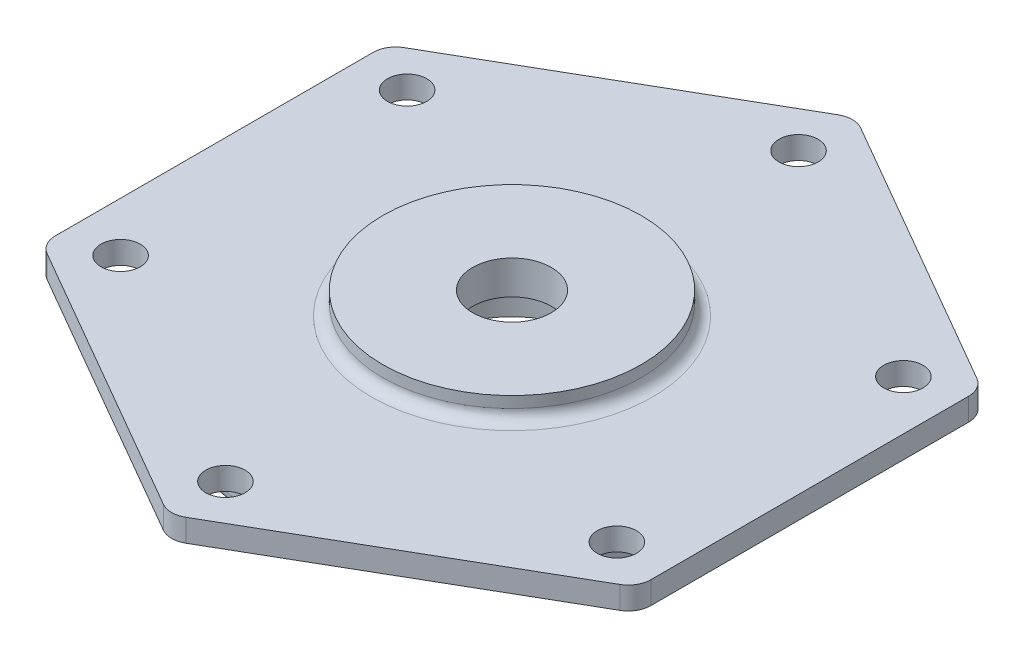
ISO-10303-21;
HEADER;
FILE_DESCRIPTION(('STEP AP214'),'2;1');
FILE_NAME('part.step','',(''),(''),'','','');
FILE_SCHEMA(('AUTOMOTIVE_DESIGN { 1 0 10303 214 1 1 1 1 }'));
ENDSEC;
DATA;
#1=APPLICATION_CONTEXT('core data for automotive mechanical design processes');
#2=APPLICATION_PROTOCOL_DEFINITION('international standard','automotive_design',2000,#1);
#3=PRODUCT_CONTEXT('',#1,'mechanical');
#4=PRODUCT('Part','Part','',(#3));
#5=PRODUCT_RELATED_PRODUCT_CATEGORY('part','',(#4));
#6=PRODUCT_DEFINITION_FORMATION('','',#4);
#7=PRODUCT_DEFINITION_CONTEXT('part definition',#1,'design');
#8=PRODUCT_DEFINITION('design','',#6,#7);
#9=PRODUCT_DEFINITION_SHAPE('','',#8);
#10=(LENGTH_UNIT() NAMED_UNIT(*) SI_UNIT(.MILLI.,.METRE.));
#11=(NAMED_UNIT(*) PLANE_ANGLE_UNIT() SI_UNIT($,.RADIAN.));
#12=(NAMED_UNIT(*) SI_UNIT($,.STERADIAN.) SOLID_ANGLE_UNIT());
#13=UNCERTAINTY_MEASURE_WITH_UNIT(LENGTH_MEASURE(1.E-05),#10,'distance_accuracy_value','');
#14=(GEOMETRIC_REPRESENTATION_CONTEXT(3) GLOBAL_UNCERTAINTY_ASSIGNED_CONTEXT((#13)) GLOBAL_UNIT_ASSIGNED_CONTEXT((#10,
#11,#12)) REPRESENTATION_CONTEXT('',''));
#15=CARTESIAN_POINT('',(0.,0.,0.));
#16=DIRECTION('',(0.,0.,1.));
#17=DIRECTION('',(1.,0.,0.));
#18=AXIS2_PLACEMENT_3D('',#15,#16,#17);
#19=CARTESIAN_POINT('',(-48.9999999999997,4.,28.2901631902923));
#20=DIRECTION('',(0.,-1.,0.));
#21=DIRECTION('',(0.,0.,-1.));
#22=AXIS2_PLACEMENT_3D('',#19,#20,#21);
#23=CYLINDRICAL_SURFACE('',#22,4.);
#24=CARTESIAN_POINT('',(-48.9999999999997,0.,28.2901631902923));
#25=DIRECTION('',(0.,1.,0.));
#26=DIRECTION('',(0.,0.,1.));
#27=AXIS2_PLACEMENT_3D('',#24,#25,#26);
#28=CIRCLE('',#27,4.);
#29=CARTESIAN_POINT('',(-52.9999999999997,0.,28.2901631902923));
#30=VERTEX_POINT('',#29);
#31=CARTESIAN_POINT('',(-50.9999999999997,0.,31.75426480543));
#32=VERTEX_POINT('',#31);
#33=EDGE_CURVE('E171',#30,#32,#28,.T.);
#34=ORIENTED_EDGE('',*,*,#33,.T.);
#35=DIRECTION('',(0.,-1.,0.));
#36=VECTOR('',#35,1.);
#37=CARTESIAN_POINT('',(-50.9999999999997,4.,31.75426480543));
#38=LINE('',#37,#36);
#39=CARTESIAN_POINT('',(-50.9999999999997,4.,31.75426480543));
#40=VERTEX_POINT('',#39);
#41=EDGE_CURVE('E219',#40,#32,#38,.T.);
#42=ORIENTED_EDGE('',*,*,#41,.F.);
#43=CARTESIAN_POINT('',(-48.9999999999997,4.,28.2901631902923));
#44=DIRECTION('',(0.,1.,0.));
#45=DIRECTION('',(0.,0.,1.));
#46=AXIS2_PLACEMENT_3D('',#43,#44,#45);
#47=CIRCLE('',#46,4.);
#48=CARTESIAN_POINT('',(-52.9999999999997,4.,28.2901631902923));
#49=VERTEX_POINT('',#48);
#50=EDGE_CURVE('E194',#49,#40,#47,.T.);
#51=ORIENTED_EDGE('',*,*,#50,.F.);
#52=DIRECTION('',(0.,-1.,0.));
#53=VECTOR('',#52,1.);
#54=CARTESIAN_POINT('',(-52.9999999999997,4.,28.2901631902923));
#55=LINE('',#54,#53);
#56=EDGE_CURVE('E167',#49,#30,#55,.T.);
#57=ORIENTED_EDGE('',*,*,#56,.T.);
#58=EDGE_LOOP('',(#34,#42,#51,#57));
#59=FACE_BOUND('',#58,.T.);
#60=ADVANCED_FACE('F47',(#59),#23,.T.);
#61=CARTESIAN_POINT('',(-50.9999999999997,4.,31.75426480543));
#62=DIRECTION('',(0.499999999999995,0.,-0.866025403784441));
#63=DIRECTION('',(-0.866025403784442,0.,-0.499999999999995));
#64=AXIS2_PLACEMENT_3D('',#61,#62,#63);
#65=PLANE('',#64);
#66=DIRECTION('',(0.866025403784441,0.,0.499999999999995));
#67=VECTOR('',#66,1.);
#68=CARTESIAN_POINT('',(-50.9999999999997,0.,31.75426480543));
#69=LINE('',#68,#67);
#70=CARTESIAN_POINT('',(-2.00000000000001,0.,60.0444279957211));
#71=VERTEX_POINT('',#70);
#72=EDGE_CURVE('E174',#32,#71,#69,.T.);
#73=ORIENTED_EDGE('',*,*,#72,.T.);
#74=DIRECTION('',(0.,-1.,0.));
#75=VECTOR('',#74,1.);
#76=CARTESIAN_POINT('',(-2.00000000000001,4.,60.0444279957211));
#77=LINE('',#76,#75);
#78=CARTESIAN_POINT('',(-2.00000000000001,4.,60.0444279957211));
#79=VERTEX_POINT('',#78);
#80=EDGE_CURVE('E216',#79,#71,#77,.T.);
#81=ORIENTED_EDGE('',*,*,#80,.F.);
#82=DIRECTION('',(0.866025403784441,0.,0.499999999999995));
#83=VECTOR('',#82,1.);
#84=CARTESIAN_POINT('',(-50.9999999999997,4.,31.75426480543));
#85=LINE('',#84,#83);
#86=EDGE_CURVE('E122',#40,#79,#85,.T.);
#87=ORIENTED_EDGE('',*,*,#86,.F.);
#88=ORIENTED_EDGE('',*,*,#41,.T.);
#89=EDGE_LOOP('',(#73,#81,#87,#88));
#90=FACE_BOUND('',#89,.T.);
#91=ADVANCED_FACE('F327',(#90),#65,.F.);
#92=CARTESIAN_POINT('',(0.,4.,56.5803263805834));
#93=DIRECTION('',(0.,-1.,0.));
#94=DIRECTION('',(0.,0.,-1.));
#95=AXIS2_PLACEMENT_3D('',#92,#93,#94);
#96=CYLINDRICAL_SURFACE('',#95,4.);
#97=CARTESIAN_POINT('',(0.,0.,56.5803263805834));
#98=DIRECTION('',(0.,1.,0.));
#99=DIRECTION('',(0.,0.,-1.));
#100=AXIS2_PLACEMENT_3D('',#97,#98,#99);
#101=CIRCLE('',#100,4.);
#102=CARTESIAN_POINT('',(2.,0.,60.0444279957211));
#103=VERTEX_POINT('',#102);
#104=EDGE_CURVE('E177',#71,#103,#101,.T.);
#105=ORIENTED_EDGE('',*,*,#104,.T.);
#106=DIRECTION('',(0.,-1.,0.));
#107=VECTOR('',#106,1.);
#108=CARTESIAN_POINT('',(2.,4.,60.0444279957211));
#109=LINE('',#108,#107);
#110=CARTESIAN_POINT('',(2.,4.,60.0444279957211));
#111=VERTEX_POINT('',#110);
#112=EDGE_CURVE('E213',#111,#103,#109,.T.);
#113=ORIENTED_EDGE('',*,*,#112,.F.);
#114=CARTESIAN_POINT('',(0.,4.,56.5803263805834));
#115=DIRECTION('',(0.,1.,0.));
#116=DIRECTION('',(0.,0.,-1.));
#117=AXIS2_PLACEMENT_3D('',#114,#115,#116);
#118=CIRCLE('',#117,4.);
#119=EDGE_CURVE('E286',#79,#111,#118,.T.);
#120=ORIENTED_EDGE('',*,*,#119,.F.);
#121=ORIENTED_EDGE('',*,*,#80,.T.);
#122=EDGE_LOOP('',(#105,#113,#120,#121));
#123=FACE_BOUND('',#122,.T.);
#124=ADVANCED_FACE('F332',(#123),#96,.T.);
#125=CARTESIAN_POINT('',(2.,4.,60.0444279957211));
#126=DIRECTION('',(-0.500000000000001,0.,-0.866025403784438));
#127=DIRECTION('',(-0.866025403784438,0.,0.500000000000001));
#128=AXIS2_PLACEMENT_3D('',#125,#126,#127);
#129=PLANE('',#128);
#130=DIRECTION('',(0.866025403784438,0.,-0.500000000000001));
#131=VECTOR('',#130,1.);
#132=CARTESIAN_POINT('',(2.,0.,60.0444279957211));
#133=LINE('',#132,#131);
#134=CARTESIAN_POINT('',(51.0000000000001,0.,31.7542648054293));
#135=VERTEX_POINT('',#134);
#136=EDGE_CURVE('E179',#103,#135,#133,.T.);
#137=ORIENTED_EDGE('',*,*,#136,.T.);
#138=DIRECTION('',(0.,-1.,0.));
#139=VECTOR('',#138,1.);
#140=CARTESIAN_POINT('',(51.0000000000001,4.,31.7542648054293));
#141=LINE('',#140,#139);
#142=CARTESIAN_POINT('',(51.0000000000001,4.,31.7542648054293));
#143=VERTEX_POINT('',#142);
#144=EDGE_CURVE('E210',#143,#135,#141,.T.);
#145=ORIENTED_EDGE('',*,*,#144,.F.);
#146=DIRECTION('',(0.866025403784438,0.,-0.500000000000001));
#147=VECTOR('',#146,1.);
#148=CARTESIAN_POINT('',(2.,4.,60.0444279957211));
#149=LINE('',#148,#147);
#150=EDGE_CURVE('E288',#111,#143,#149,.T.);
#151=ORIENTED_EDGE('',*,*,#150,.F.);
#152=ORIENTED_EDGE('',*,*,#112,.T.);
#153=EDGE_LOOP('',(#137,#145,#151,#152));
#154=FACE_BOUND('',#153,.T.);
#155=ADVANCED_FACE('F684',(#154),#129,.F.);
#156=CARTESIAN_POINT('',(49.0000000000001,4.,28.2901631902916));
#157=DIRECTION('',(0.,-1.,0.));
#158=DIRECTION('',(0.,0.,-1.));
#159=AXIS2_PLACEMENT_3D('',#156,#157,#158);
#160=CYLINDRICAL_SURFACE('',#159,4.);
#161=CARTESIAN_POINT('',(49.0000000000001,0.,28.2901631902916));
#162=DIRECTION('',(0.,1.,0.));
#163=DIRECTION('',(0.,0.,1.));
#164=AXIS2_PLACEMENT_3D('',#161,#162,#163);
#165=CIRCLE('',#164,4.);
#166=CARTESIAN_POINT('',(53.0000000000001,0.,28.2901631902915));
#167=VERTEX_POINT('',#166);
#168=EDGE_CURVE('E181',#135,#167,#165,.T.);
#169=ORIENTED_EDGE('',*,*,#168,.T.);
#170=DIRECTION('',(0.,-1.,0.));
#171=VECTOR('',#170,1.);
#172=CARTESIAN_POINT('',(53.0000000000001,4.,28.2901631902915));
#173=LINE('',#172,#171);
#174=CARTESIAN_POINT('',(53.0000000000001,4.,28.2901631902915));
#175=VERTEX_POINT('',#174);
#176=EDGE_CURVE('E207',#175,#167,#173,.T.);
#177=ORIENTED_EDGE('',*,*,#176,.F.);
#178=CARTESIAN_POINT('',(49.0000000000001,4.,28.2901631902916));
#179=DIRECTION('',(0.,1.,0.));
#180=DIRECTION('',(0.,0.,1.));
#181=AXIS2_PLACEMENT_3D('',#178,#179,#180);
#182=CIRCLE('',#181,4.);
#183=EDGE_CURVE('E290',#143,#175,#182,.T.);
#184=ORIENTED_EDGE('',*,*,#183,.F.);
#185=ORIENTED_EDGE('',*,*,#144,.T.);
#186=EDGE_LOOP('',(#169,#177,#184,#185));
#187=FACE_BOUND('',#186,.T.);
#188=ADVANCED_FACE('F674',(#187),#160,.T.);
#189=CARTESIAN_POINT('',(53.0000000000001,4.,28.2901631902915));
#190=DIRECTION('',(-1.,0.,0.));
#191=DIRECTION('',(0.,0.,1.));
#192=AXIS2_PLACEMENT_3D('',#189,#190,#191);
#193=PLANE('',#192);
#194=DIRECTION('',(0.,0.,-1.));
#195=VECTOR('',#194,1.);
#196=CARTESIAN_POINT('',(53.0000000000001,0.,28.2901631902915));
#197=LINE('',#196,#195);
#198=CARTESIAN_POINT('',(52.9999999999999,0.,-28.2901631902919));
#199=VERTEX_POINT('',#198);
#200=EDGE_CURVE('E183',#167,#199,#197,.T.);
#201=ORIENTED_EDGE('',*,*,#200,.T.);
#202=DIRECTION('',(0.,-1.,0.));
#203=VECTOR('',#202,1.);
#204=CARTESIAN_POINT('',(52.9999999999999,4.,-28.2901631902919));
#205=LINE('',#204,#203);
#206=CARTESIAN_POINT('',(52.9999999999999,4.,-28.2901631902919));
#207=VERTEX_POINT('',#206);
#208=EDGE_CURVE('E204',#207,#199,#205,.T.);
#209=ORIENTED_EDGE('',*,*,#208,.F.);
#210=DIRECTION('',(0.,0.,-1.));
#211=VECTOR('',#210,1.);
#212=CARTESIAN_POINT('',(53.0000000000001,4.,28.2901631902915));
#213=LINE('',#212,#211);
#214=EDGE_CURVE('E292',#175,#207,#213,.T.);
#215=ORIENTED_EDGE('',*,*,#214,.F.);
#216=ORIENTED_EDGE('',*,*,#176,.T.);
#217=EDGE_LOOP('',(#201,#209,#215,#216));
#218=FACE_BOUND('',#217,.T.);
#219=ADVANCED_FACE('F664',(#218),#193,.F.);
#220=CARTESIAN_POINT('',(48.9999999999999,4.,-28.2901631902919));
#221=DIRECTION('',(0.,-1.,0.));
#222=DIRECTION('',(0.,0.,-1.));
#223=AXIS2_PLACEMENT_3D('',#220,#221,#222);
#224=CYLINDRICAL_SURFACE('',#223,4.);
#225=CARTESIAN_POINT('',(48.9999999999999,0.,-28.2901631902919));
#226=DIRECTION('',(0.,1.,0.));
#227=DIRECTION('',(0.,0.,1.));
#228=AXIS2_PLACEMENT_3D('',#225,#226,#227);
#229=CIRCLE('',#228,4.);
#230=CARTESIAN_POINT('',(50.9999999999999,0.,-31.7542648054297));
#231=VERTEX_POINT('',#230);
#232=EDGE_CURVE('E185',#199,#231,#229,.T.);
#233=ORIENTED_EDGE('',*,*,#232,.T.);
#234=DIRECTION('',(0.,-1.,0.));
#235=VECTOR('',#234,1.);
#236=CARTESIAN_POINT('',(50.9999999999999,4.,-31.7542648054297));
#237=LINE('',#236,#235);
#238=CARTESIAN_POINT('',(50.9999999999999,4.,-31.7542648054297));
#239=VERTEX_POINT('',#238);
#240=EDGE_CURVE('E201',#239,#231,#237,.T.);
#241=ORIENTED_EDGE('',*,*,#240,.F.);
#242=CARTESIAN_POINT('',(48.9999999999999,4.,-28.2901631902919));
#243=DIRECTION('',(0.,1.,0.));
#244=DIRECTION('',(0.,0.,1.));
#245=AXIS2_PLACEMENT_3D('',#242,#243,#244);
#246=CIRCLE('',#245,4.);
#247=EDGE_CURVE('E294',#207,#239,#246,.T.);
#248=ORIENTED_EDGE('',*,*,#247,.F.);
#249=ORIENTED_EDGE('',*,*,#208,.T.);
#250=EDGE_LOOP('',(#233,#241,#248,#249));
#251=FACE_BOUND('',#250,.T.);
#252=ADVANCED_FACE('F655',(#251),#224,.T.);
#253=CARTESIAN_POINT('',(50.9999999999999,4.,-31.7542648054297));
#254=DIRECTION('',(-0.499999999999995,0.,0.866025403784442));
#255=DIRECTION('',(0.866025403784442,0.,0.499999999999995));
#256=AXIS2_PLACEMENT_3D('',#253,#254,#255);
#257=PLANE('',#256);
#258=DIRECTION('',(-0.866025403784442,0.,-0.499999999999995));
#259=VECTOR('',#258,1.);
#260=CARTESIAN_POINT('',(50.9999999999999,0.,-31.7542648054297));
#261=LINE('',#260,#259);
#262=CARTESIAN_POINT('',(1.9999999999996,0.,-60.0444279957211));
#263=VERTEX_POINT('',#262);
#264=EDGE_CURVE('E187',#231,#263,#261,.T.);
#265=ORIENTED_EDGE('',*,*,#264,.T.);
#266=DIRECTION('',(0.,-1.,0.));
#267=VECTOR('',#266,1.);
#268=CARTESIAN_POINT('',(1.9999999999996,4.,-60.0444279957211));
#269=LINE('',#268,#267);
#270=CARTESIAN_POINT('',(1.9999999999996,4.,-60.0444279957211));
#271=VERTEX_POINT('',#270);
#272=EDGE_CURVE('E198',#271,#263,#269,.T.);
#273=ORIENTED_EDGE('',*,*,#272,.F.);
#274=DIRECTION('',(-0.866025403784442,0.,-0.499999999999995));
#275=VECTOR('',#274,1.);
#276=CARTESIAN_POINT('',(50.9999999999999,4.,-31.7542648054297));
#277=LINE('',#276,#275);
#278=EDGE_CURVE('E296',#239,#271,#277,.T.);
#279=ORIENTED_EDGE('',*,*,#278,.F.);
#280=ORIENTED_EDGE('',*,*,#240,.T.);
#281=EDGE_LOOP('',(#265,#273,#279,#280));
#282=FACE_BOUND('',#281,.T.);
#283=ADVANCED_FACE('F302',(#282),#257,.F.);
#284=CARTESIAN_POINT('',(-3.95045457329304E-13,4.,-56.5803263805834));
#285=DIRECTION('',(0.,-1.,0.));
#286=DIRECTION('',(0.,0.,-1.));
#287=AXIS2_PLACEMENT_3D('',#284,#285,#286);
#288=CYLINDRICAL_SURFACE('',#287,4.);
#289=CARTESIAN_POINT('',(-3.95045457329304E-13,0.,-56.5803263805834));
#290=DIRECTION('',(0.,1.,0.));
#291=DIRECTION('',(0.,0.,1.));
#292=AXIS2_PLACEMENT_3D('',#289,#290,#291);
#293=CIRCLE('',#292,4.);
#294=CARTESIAN_POINT('',(-2.00000000000044,0.,-60.0444279957211));
#295=VERTEX_POINT('',#294);
#296=EDGE_CURVE('E189',#263,#295,#293,.T.);
#297=ORIENTED_EDGE('',*,*,#296,.T.);
#298=DIRECTION('',(0.,-1.,0.));
#299=VECTOR('',#298,1.);
#300=CARTESIAN_POINT('',(-2.00000000000044,4.,-60.0444279957211));
#301=LINE('',#300,#299);
#302=CARTESIAN_POINT('',(-2.00000000000044,4.,-60.0444279957211));
#303=VERTEX_POINT('',#302);
#304=EDGE_CURVE('E162',#303,#295,#301,.T.);
#305=ORIENTED_EDGE('',*,*,#304,.F.);
#306=CARTESIAN_POINT('',(-3.95045457329304E-13,4.,-56.5803263805834));
#307=DIRECTION('',(0.,1.,0.));
#308=DIRECTION('',(0.,0.,1.));
#309=AXIS2_PLACEMENT_3D('',#306,#307,#308);
#310=CIRCLE('',#309,4.);
#311=EDGE_CURVE('E153',#271,#303,#310,.T.);
#312=ORIENTED_EDGE('',*,*,#311,.F.);
#313=ORIENTED_EDGE('',*,*,#272,.T.);
#314=EDGE_LOOP('',(#297,#305,#312,#313));
#315=FACE_BOUND('',#314,.T.);
#316=ADVANCED_FACE('F306',(#315),#288,.T.);
#317=CARTESIAN_POINT('',(-2.00000000000044,4.,-60.0444279957211));
#318=DIRECTION('',(0.500000000000007,0.,0.866025403784435));
#319=DIRECTION('',(0.866025403784435,0.,-0.500000000000007));
#320=AXIS2_PLACEMENT_3D('',#317,#318,#319);
#321=PLANE('',#320);
#322=DIRECTION('',(-0.866025403784435,0.,0.500000000000007));
#323=VECTOR('',#322,1.);
#324=CARTESIAN_POINT('',(-2.00000000000044,0.,-60.0444279957211));
#325=LINE('',#324,#323);
#326=CARTESIAN_POINT('',(-51.0000000000003,0.,-31.754264805429));
#327=VERTEX_POINT('',#326);
#328=EDGE_CURVE('E161',#295,#327,#325,.T.);
#329=ORIENTED_EDGE('',*,*,#328,.T.);
#330=DIRECTION('',(0.,-1.,0.));
#331=VECTOR('',#330,1.);
#332=CARTESIAN_POINT('',(-51.0000000000003,4.,-31.754264805429));
#333=LINE('',#332,#331);
#334=CARTESIAN_POINT('',(-51.0000000000003,4.,-31.754264805429));
#335=VERTEX_POINT('',#334);
#336=EDGE_CURVE('E158',#335,#327,#333,.T.);
#337=ORIENTED_EDGE('',*,*,#336,.F.);
#338=DIRECTION('',(-0.866025403784435,0.,0.500000000000007));
#339=VECTOR('',#338,1.);
#340=CARTESIAN_POINT('',(-2.00000000000044,4.,-60.0444279957211));
#341=LINE('',#340,#339);
#342=EDGE_CURVE('E147',#303,#335,#341,.T.);
#343=ORIENTED_EDGE('',*,*,#342,.F.);
#344=ORIENTED_EDGE('',*,*,#304,.T.);
#345=EDGE_LOOP('',(#329,#337,#343,#344));
#346=FACE_BOUND('',#345,.T.);
#347=ADVANCED_FACE('F159',(#346),#321,.F.);
#348=CARTESIAN_POINT('',(-49.0000000000003,4.,-28.2901631902912));
#349=DIRECTION('',(0.,-1.,0.));
#350=DIRECTION('',(0.,0.,-1.));
#351=AXIS2_PLACEMENT_3D('',#348,#349,#350);
#352=CYLINDRICAL_SURFACE('',#351,4.);
#353=CARTESIAN_POINT('',(-49.0000000000003,0.,-28.2901631902912));
#354=DIRECTION('',(0.,1.,0.));
#355=DIRECTION('',(0.,0.,1.));
#356=AXIS2_PLACEMENT_3D('',#353,#354,#355);
#357=CIRCLE('',#356,4.);
#358=CARTESIAN_POINT('',(-53.0000000000003,0.,-28.2901631902912));
#359=VERTEX_POINT('',#358);
#360=EDGE_CURVE('E107',#327,#359,#357,.T.);
#361=ORIENTED_EDGE('',*,*,#360,.T.);
#362=DIRECTION('',(0.,-1.,0.));
#363=VECTOR('',#362,1.);
#364=CARTESIAN_POINT('',(-53.0000000000003,4.,-28.2901631902912));
#365=LINE('',#364,#363);
#366=CARTESIAN_POINT('',(-53.0000000000003,4.,-28.2901631902912));
#367=VERTEX_POINT('',#366);
#368=EDGE_CURVE('E163',#367,#359,#365,.T.);
#369=ORIENTED_EDGE('',*,*,#368,.F.);
#370=CARTESIAN_POINT('',(-49.0000000000003,4.,-28.2901631902912));
#371=DIRECTION('',(0.,1.,0.));
#372=DIRECTION('',(0.,0.,1.));
#373=AXIS2_PLACEMENT_3D('',#370,#371,#372);
#374=CIRCLE('',#373,4.);
#375=EDGE_CURVE('E151',#335,#367,#374,.T.);
#376=ORIENTED_EDGE('',*,*,#375,.F.);
#377=ORIENTED_EDGE('',*,*,#336,.T.);
#378=EDGE_LOOP('',(#361,#369,#376,#377));
#379=FACE_BOUND('',#378,.T.);
#380=ADVANCED_FACE('F165',(#379),#352,.T.);
#381=CARTESIAN_POINT('',(-53.0000000000003,4.,-28.2901631902912));
#382=DIRECTION('',(1.,0.,0.));
#383=DIRECTION('',(0.,0.,-1.));
#384=AXIS2_PLACEMENT_3D('',#381,#382,#383);
#385=PLANE('',#384);
#386=DIRECTION('',(0.,0.,1.));
#387=VECTOR('',#386,1.);
#388=CARTESIAN_POINT('',(-53.0000000000003,0.,-28.2901631902912));
#389=LINE('',#388,#387);
#390=EDGE_CURVE('E113',#359,#30,#389,.T.);
#391=ORIENTED_EDGE('',*,*,#390,.T.);
#392=ORIENTED_EDGE('',*,*,#56,.F.);
#393=DIRECTION('',(0.,0.,1.));
#394=VECTOR('',#393,1.);
#395=CARTESIAN_POINT('',(-53.0000000000003,4.,-28.2901631902912));
#396=LINE('',#395,#394);
#397=EDGE_CURVE('E66',#367,#49,#396,.T.);
#398=ORIENTED_EDGE('',*,*,#397,.F.);
#399=ORIENTED_EDGE('',*,*,#368,.T.);
#400=EDGE_LOOP('',(#391,#392,#398,#399));
#401=FACE_BOUND('',#400,.T.);
#402=ADVANCED_FACE('F314',(#401),#385,.F.);
#403=CARTESIAN_POINT('',(-48.9999999999997,4.,28.2901631902923));
#404=DIRECTION('',(0.,1.,0.));
#405=DIRECTION('',(0.,0.,1.));
#406=AXIS2_PLACEMENT_3D('',#403,#404,#405);
#407=PLANE('',#406);
#408=CARTESIAN_POINT('',(0.,4.,-51.));
#409=DIRECTION('',(0.,1.,0.));
#410=DIRECTION('',(0.,0.,1.));
#411=AXIS2_PLACEMENT_3D('',#408,#409,#410);
#412=CIRCLE('',#411,3.5);
#413=CARTESIAN_POINT('',(0.,4.,-47.5));
#414=VERTEX_POINT('',#413);
#415=EDGE_CURVE('E240',#414,#414,#412,.T.);
#416=ORIENTED_EDGE('',*,*,#415,.F.);
#417=EDGE_LOOP('',(#416));
#418=FACE_BOUND('',#417,.T.);
#419=CARTESIAN_POINT('',(-44.1672955930057,4.,-25.4999999999987));
#420=DIRECTION('',(0.,1.,0.));
#421=DIRECTION('',(0.,0.,1.));
#422=AXIS2_PLACEMENT_3D('',#419,#420,#421);
#423=CIRCLE('',#422,3.50000000000166);
#424=CARTESIAN_POINT('',(-44.1672955930057,4.,-21.9999999999971));
#425=VERTEX_POINT('',#424);
#426=EDGE_CURVE('E570',#425,#425,#423,.T.);
#427=ORIENTED_EDGE('',*,*,#426,.F.);
#428=EDGE_LOOP('',(#427));
#429=FACE_BOUND('',#428,.T.);
#430=CARTESIAN_POINT('',(-44.1672955930042,4.,25.5000000000013));
#431=DIRECTION('',(0.,1.,0.));
#432=DIRECTION('',(0.,0.,1.));
#433=AXIS2_PLACEMENT_3D('',#430,#431,#432);
#434=CIRCLE('',#433,3.50000000000291);
#435=CARTESIAN_POINT('',(-44.1672955930042,4.,29.0000000000042));
#436=VERTEX_POINT('',#435);
#437=EDGE_CURVE('E572',#436,#436,#434,.T.);
#438=ORIENTED_EDGE('',*,*,#437,.F.);
#439=EDGE_LOOP('',(#438));
#440=FACE_BOUND('',#439,.T.);
#441=CARTESIAN_POINT('',(2.88027726587425E-12,4.,51.));
#442=DIRECTION('',(0.,1.,0.));
#443=DIRECTION('',(0.,0.,1.));
#444=AXIS2_PLACEMENT_3D('',#441,#442,#443);
#445=CIRCLE('',#444,3.5000000000031);
#446=CARTESIAN_POINT('',(2.88027726587425E-12,4.,54.5000000000031));
#447=VERTEX_POINT('',#446);
#448=EDGE_CURVE('E576',#447,#447,#445,.T.);
#449=ORIENTED_EDGE('',*,*,#448,.F.);
#450=EDGE_LOOP('',(#449));
#451=FACE_BOUND('',#450,.T.);
#452=CARTESIAN_POINT('',(44.1672955930085,4.,25.4999999999987));
#453=DIRECTION('',(0.,1.,0.));
#454=DIRECTION('',(0.,0.,1.));
#455=AXIS2_PLACEMENT_3D('',#452,#453,#454);
#456=CIRCLE('',#455,3.50000000000194);
#457=CARTESIAN_POINT('',(44.1672955930085,4.,29.0000000000007));
#458=VERTEX_POINT('',#457);
#459=EDGE_CURVE('E567',#458,#458,#456,.T.);
#460=ORIENTED_EDGE('',*,*,#459,.F.);
#461=EDGE_LOOP('',(#460));
#462=FACE_BOUND('',#461,.T.);
#463=CARTESIAN_POINT('',(44.1672955930071,4.,-25.5000000000013));
#464=DIRECTION('',(0.,1.,0.));
#465=DIRECTION('',(0.,0.,1.));
#466=AXIS2_PLACEMENT_3D('',#463,#464,#465);
#467=CIRCLE('',#466,3.50000000000046);
#468=CARTESIAN_POINT('',(44.1672955930071,4.,-22.0000000000008));
#469=VERTEX_POINT('',#468);
#470=EDGE_CURVE('E565',#469,#469,#467,.T.);
#471=ORIENTED_EDGE('',*,*,#470,.F.);
#472=EDGE_LOOP('',(#471));
#473=FACE_BOUND('',#472,.T.);
#474=CARTESIAN_POINT('',(0.,4.,0.));
#475=DIRECTION('',(0.,1.,0.));
#476=DIRECTION('',(0.,0.,1.));
#477=AXIS2_PLACEMENT_3D('',#474,#475,#476);
#478=CIRCLE('',#477,25.);
#479=CARTESIAN_POINT('',(0.,4.,25.));
#480=VERTEX_POINT('',#479);
#481=EDGE_CURVE('E231',#480,#480,#478,.F.);
#482=ORIENTED_EDGE('',*,*,#481,.T.);
#483=EDGE_LOOP('',(#482));
#484=FACE_BOUND('',#483,.T.);
#485=ORIENTED_EDGE('',*,*,#50,.T.);
#486=ORIENTED_EDGE('',*,*,#86,.T.);
#487=ORIENTED_EDGE('',*,*,#119,.T.);
#488=ORIENTED_EDGE('',*,*,#150,.T.);
#489=ORIENTED_EDGE('',*,*,#183,.T.);
#490=ORIENTED_EDGE('',*,*,#214,.T.);
#491=ORIENTED_EDGE('',*,*,#247,.T.);
#492=ORIENTED_EDGE('',*,*,#278,.T.);
#493=ORIENTED_EDGE('',*,*,#311,.T.);
#494=ORIENTED_EDGE('',*,*,#342,.T.);
#495=ORIENTED_EDGE('',*,*,#375,.T.);
#496=ORIENTED_EDGE('',*,*,#397,.T.);
#497=EDGE_LOOP('',(#485,#486,#487,#488,#489,#490,#491,#492,#493,#494,#495,#496));
#498=FACE_BOUND('',#497,.T.);
#499=ADVANCED_FACE('F149',(#418,#429,#440,#451,#462,#473,#484,#498),#407,.T.);
#500=CARTESIAN_POINT('',(-48.9999999999997,0.,28.2901631902923));
#501=DIRECTION('',(0.,1.,0.));
#502=DIRECTION('',(0.,0.,1.));
#503=AXIS2_PLACEMENT_3D('',#500,#501,#502);
#504=PLANE('',#503);
#505=CARTESIAN_POINT('',(0.,0.,-51.));
#506=DIRECTION('',(0.,1.,0.));
#507=DIRECTION('',(0.,0.,1.));
#508=AXIS2_PLACEMENT_3D('',#505,#506,#507);
#509=CIRCLE('',#508,3.5);
#510=CARTESIAN_POINT('',(0.,0.,-47.5));
#511=VERTEX_POINT('',#510);
#512=EDGE_CURVE('E51',#511,#511,#509,.T.);
#513=ORIENTED_EDGE('',*,*,#512,.T.);
#514=EDGE_LOOP('',(#513));
#515=FACE_BOUND('',#514,.T.);
#516=CARTESIAN_POINT('',(-44.1672955930057,0.,-25.4999999999987));
#517=DIRECTION('',(0.,1.,0.));
#518=DIRECTION('',(0.,0.,1.));
#519=AXIS2_PLACEMENT_3D('',#516,#517,#518);
#520=CIRCLE('',#519,3.50000000000166);
#521=CARTESIAN_POINT('',(-44.1672955930057,0.,-21.9999999999971));
#522=VERTEX_POINT('',#521);
#523=EDGE_CURVE('E248',#522,#522,#520,.T.);
#524=ORIENTED_EDGE('',*,*,#523,.T.);
#525=EDGE_LOOP('',(#524));
#526=FACE_BOUND('',#525,.T.);
#527=CARTESIAN_POINT('',(-44.1672955930042,0.,25.5000000000013));
#528=DIRECTION('',(0.,1.,0.));
#529=DIRECTION('',(0.,0.,1.));
#530=AXIS2_PLACEMENT_3D('',#527,#528,#529);
#531=CIRCLE('',#530,3.50000000000291);
#532=CARTESIAN_POINT('',(-44.1672955930042,0.,29.0000000000042));
#533=VERTEX_POINT('',#532);
#534=EDGE_CURVE('E246',#533,#533,#531,.T.);
#535=ORIENTED_EDGE('',*,*,#534,.T.);
#536=EDGE_LOOP('',(#535));
#537=FACE_BOUND('',#536,.T.);
#538=CARTESIAN_POINT('',(2.88027726587425E-12,0.,51.));
#539=DIRECTION('',(0.,1.,0.));
#540=DIRECTION('',(0.,0.,1.));
#541=AXIS2_PLACEMENT_3D('',#538,#539,#540);
#542=CIRCLE('',#541,3.5000000000031);
#543=CARTESIAN_POINT('',(2.88027726587425E-12,0.,54.5000000000031));
#544=VERTEX_POINT('',#543);
#545=EDGE_CURVE('E243',#544,#544,#542,.T.);
#546=ORIENTED_EDGE('',*,*,#545,.T.);
#547=EDGE_LOOP('',(#546));
#548=FACE_BOUND('',#547,.T.);
#549=CARTESIAN_POINT('',(44.1672955930085,0.,25.4999999999987));
#550=DIRECTION('',(0.,1.,0.));
#551=DIRECTION('',(0.,0.,1.));
#552=AXIS2_PLACEMENT_3D('',#549,#550,#551);
#553=CIRCLE('',#552,3.50000000000194);
#554=CARTESIAN_POINT('',(44.1672955930085,0.,29.0000000000007));
#555=VERTEX_POINT('',#554);
#556=EDGE_CURVE('E239',#555,#555,#553,.T.);
#557=ORIENTED_EDGE('',*,*,#556,.T.);
#558=EDGE_LOOP('',(#557));
#559=FACE_BOUND('',#558,.T.);
#560=CARTESIAN_POINT('',(44.1672955930071,0.,-25.5000000000013));
#561=DIRECTION('',(0.,1.,0.));
#562=DIRECTION('',(0.,0.,1.));
#563=AXIS2_PLACEMENT_3D('',#560,#561,#562);
#564=CIRCLE('',#563,3.50000000000046);
#565=CARTESIAN_POINT('',(44.1672955930071,0.,-22.0000000000008));
#566=VERTEX_POINT('',#565);
#567=EDGE_CURVE('E236',#566,#566,#564,.T.);
#568=ORIENTED_EDGE('',*,*,#567,.T.);
#569=EDGE_LOOP('',(#568));
#570=FACE_BOUND('',#569,.T.);
#571=CARTESIAN_POINT('',(0.,0.,0.));
#572=DIRECTION('',(0.,-1.,0.));
#573=DIRECTION('',(0.,0.,-1.));
#574=AXIS2_PLACEMENT_3D('',#571,#572,#573);
#575=CIRCLE('',#574,45.);
#576=CARTESIAN_POINT('',(0.,0.,-45.));
#577=VERTEX_POINT('',#576);
#578=EDGE_CURVE('E221',#577,#577,#575,.T.);
#579=ORIENTED_EDGE('',*,*,#578,.F.);
#580=EDGE_LOOP('',(#579));
#581=FACE_BOUND('',#580,.T.);
#582=ORIENTED_EDGE('',*,*,#33,.F.);
#583=ORIENTED_EDGE('',*,*,#390,.F.);
#584=ORIENTED_EDGE('',*,*,#360,.F.);
#585=ORIENTED_EDGE('',*,*,#328,.F.);
#586=ORIENTED_EDGE('',*,*,#296,.F.);
#587=ORIENTED_EDGE('',*,*,#264,.F.);
#588=ORIENTED_EDGE('',*,*,#232,.F.);
#589=ORIENTED_EDGE('',*,*,#200,.F.);
#590=ORIENTED_EDGE('',*,*,#168,.F.);
#591=ORIENTED_EDGE('',*,*,#136,.F.);
#592=ORIENTED_EDGE('',*,*,#104,.F.);
#593=ORIENTED_EDGE('',*,*,#72,.F.);
#594=EDGE_LOOP('',(#582,#583,#584,#585,#586,#587,#588,#589,#590,#591,#592,#593));
#595=FACE_BOUND('',#594,.T.);
#596=ADVANCED_FACE('F309',(#515,#526,#537,#548,#559,#570,#581,#595),#504,.F.);
#597=CARTESIAN_POINT('',(0.,8.,0.));
#598=DIRECTION('',(0.,-1.,0.));
#599=DIRECTION('',(0.,0.,-1.));
#600=AXIS2_PLACEMENT_3D('',#597,#598,#599);
#601=CYLINDRICAL_SURFACE('',#600,23.);
#602=CARTESIAN_POINT('',(0.,6.,0.));
#603=DIRECTION('',(0.,1.,0.));
#604=DIRECTION('',(0.,0.,1.));
#605=AXIS2_PLACEMENT_3D('',#602,#603,#604);
#606=CIRCLE('',#605,23.);
#607=CARTESIAN_POINT('',(0.,6.,23.));
#608=VERTEX_POINT('',#607);
#609=EDGE_CURVE('E228',#608,#608,#606,.T.);
#610=ORIENTED_EDGE('',*,*,#609,.T.);
#611=EDGE_LOOP('',(#610));
#612=FACE_BOUND('',#611,.T.);
#613=CARTESIAN_POINT('',(0.,8.,0.));
#614=DIRECTION('',(0.,1.,0.));
#615=DIRECTION('',(0.,0.,1.));
#616=AXIS2_PLACEMENT_3D('',#613,#614,#615);
#617=CIRCLE('',#616,23.);
#618=CARTESIAN_POINT('',(0.,8.,23.));
#619=VERTEX_POINT('',#618);
#620=EDGE_CURVE('E175',#619,#619,#617,.T.);
#621=ORIENTED_EDGE('',*,*,#620,.F.);
#622=EDGE_LOOP('',(#621));
#623=FACE_BOUND('',#622,.T.);
#624=ADVANCED_FACE('F354',(#612,#623),#601,.T.);
#625=CARTESIAN_POINT('',(0.,8.,0.));
#626=DIRECTION('',(0.,1.,0.));
#627=DIRECTION('',(0.,0.,1.));
#628=AXIS2_PLACEMENT_3D('',#625,#626,#627);
#629=PLANE('',#628);
#630=CARTESIAN_POINT('',(0.,8.,0.));
#631=DIRECTION('',(0.,-1.,0.));
#632=DIRECTION('',(0.,0.,-1.));
#633=AXIS2_PLACEMENT_3D('',#630,#631,#632);
#634=CIRCLE('',#633,7.);
#635=CARTESIAN_POINT('',(0.,8.,-7.));
#636=VERTEX_POINT('',#635);
#637=EDGE_CURVE('E257',#636,#636,#634,.T.);
#638=ORIENTED_EDGE('',*,*,#637,.T.);
#639=EDGE_LOOP('',(#638));
#640=FACE_BOUND('',#639,.T.);
#641=ORIENTED_EDGE('',*,*,#620,.T.);
#642=EDGE_LOOP('',(#641));
#643=FACE_BOUND('',#642,.T.);
#644=ADVANCED_FACE('F356',(#640,#643),#629,.T.);
#645=CARTESIAN_POINT('',(0.,-6.,0.));
#646=DIRECTION('',(0.,1.,0.));
#647=DIRECTION('',(0.,0.,1.));
#648=AXIS2_PLACEMENT_3D('',#645,#646,#647);
#649=CYLINDRICAL_SURFACE('',#648,45.);
#650=CARTESIAN_POINT('',(0.,-4.,0.));
#651=DIRECTION('',(0.,-1.,0.));
#652=DIRECTION('',(0.,0.,-1.));
#653=AXIS2_PLACEMENT_3D('',#650,#651,#652);
#654=CIRCLE('',#653,45.);
#655=CARTESIAN_POINT('',(0.,-4.,-45.));
#656=VERTEX_POINT('',#655);
#657=EDGE_CURVE('E11',#656,#656,#654,.F.);
#658=ORIENTED_EDGE('',*,*,#657,.T.);
#659=EDGE_LOOP('',(#658));
#660=FACE_BOUND('',#659,.T.);
#661=ORIENTED_EDGE('',*,*,#578,.T.);
#662=EDGE_LOOP('',(#661));
#663=FACE_BOUND('',#662,.T.);
#664=ADVANCED_FACE('F361',(#660,#663),#649,.T.);
#665=CARTESIAN_POINT('',(0.,-6.,0.));
#666=DIRECTION('',(0.,-1.,0.));
#667=DIRECTION('',(0.,0.,-1.));
#668=AXIS2_PLACEMENT_3D('',#665,#666,#667);
#669=PLANE('',#668);
#670=CARTESIAN_POINT('',(0.,-6.,0.));
#671=DIRECTION('',(0.,-1.,0.));
#672=DIRECTION('',(0.,0.,-1.));
#673=AXIS2_PLACEMENT_3D('',#670,#671,#672);
#674=CIRCLE('',#673,43.);
#675=CARTESIAN_POINT('',(0.,-6.,-43.));
#676=VERTEX_POINT('',#675);
#677=EDGE_CURVE('E57',#676,#676,#674,.T.);
#678=ORIENTED_EDGE('',*,*,#677,.T.);
#679=EDGE_LOOP('',(#678));
#680=FACE_BOUND('',#679,.T.);
#681=CARTESIAN_POINT('',(0.,-6.,0.));
#682=DIRECTION('',(0.,-1.,0.));
#683=DIRECTION('',(0.,0.,-1.));
#684=AXIS2_PLACEMENT_3D('',#681,#682,#683);
#685=CIRCLE('',#684,40.);
#686=CARTESIAN_POINT('',(0.,-6.,-40.));
#687=VERTEX_POINT('',#686);
#688=EDGE_CURVE('E274',#687,#687,#685,.T.);
#689=ORIENTED_EDGE('',*,*,#688,.F.);
#690=EDGE_LOOP('',(#689));
#691=FACE_BOUND('',#690,.T.);
#692=ADVANCED_FACE('F368',(#680,#691),#669,.T.);
#693=CARTESIAN_POINT('',(0.,0.,0.));
#694=DIRECTION('',(0.,-1.,0.));
#695=DIRECTION('',(0.,0.,-1.));
#696=AXIS2_PLACEMENT_3D('',#693,#694,#695);
#697=CYLINDRICAL_SURFACE('',#696,40.);
#698=CARTESIAN_POINT('',(0.,0.,0.));
#699=DIRECTION('',(0.,-1.,0.));
#700=DIRECTION('',(0.,0.,-1.));
#701=AXIS2_PLACEMENT_3D('',#698,#699,#700);
#702=CIRCLE('',#701,40.);
#703=CARTESIAN_POINT('',(0.,0.,-40.));
#704=VERTEX_POINT('',#703);
#705=EDGE_CURVE('E275',#704,#704,#702,.T.);
#706=ORIENTED_EDGE('',*,*,#705,.F.);
#707=EDGE_LOOP('',(#706));
#708=FACE_BOUND('',#707,.T.);
#709=ORIENTED_EDGE('',*,*,#688,.T.);
#710=EDGE_LOOP('',(#709));
#711=FACE_BOUND('',#710,.T.);
#712=ADVANCED_FACE('F427',(#708,#711),#697,.F.);
#713=CARTESIAN_POINT('',(0.,0.,0.));
#714=DIRECTION('',(0.,-1.,0.));
#715=DIRECTION('',(0.,0.,-1.));
#716=AXIS2_PLACEMENT_3D('',#713,#714,#715);
#717=PLANE('',#716);
#718=CARTESIAN_POINT('',(1.21595768429811,0.,0.));
#719=DIRECTION('',(0.,-1.,0.));
#720=DIRECTION('',(0.,0.,-1.));
#721=AXIS2_PLACEMENT_3D('',#718,#719,#720);
#722=CIRCLE('',#721,19.);
#723=CARTESIAN_POINT('',(1.21595768429811,0.,-19.));
#724=VERTEX_POINT('',#723);
#725=EDGE_CURVE('E269',#724,#724,#722,.T.);
#726=ORIENTED_EDGE('',*,*,#725,.F.);
#727=EDGE_LOOP('',(#726));
#728=FACE_BOUND('',#727,.T.);
#729=ORIENTED_EDGE('',*,*,#705,.T.);
#730=EDGE_LOOP('',(#729));
#731=FACE_BOUND('',#730,.T.);
#732=ADVANCED_FACE('F423',(#728,#731),#717,.T.);
#733=CARTESIAN_POINT('',(1.21595768429811,0.,0.));
#734=DIRECTION('',(0.,-1.,0.));
#735=DIRECTION('',(0.,0.,-1.));
#736=AXIS2_PLACEMENT_3D('',#733,#734,#735);
#737=CYLINDRICAL_SURFACE('',#736,19.);
#738=CARTESIAN_POINT('',(1.21595768429811,-4.,0.));
#739=DIRECTION('',(0.,-1.,0.));
#740=DIRECTION('',(0.,0.,-1.));
#741=AXIS2_PLACEMENT_3D('',#738,#739,#740);
#742=CIRCLE('',#741,19.);
#743=CARTESIAN_POINT('',(1.21595768429811,-4.,-19.));
#744=VERTEX_POINT('',#743);
#745=EDGE_CURVE('E225',#744,#744,#742,.F.);
#746=ORIENTED_EDGE('',*,*,#745,.T.);
#747=EDGE_LOOP('',(#746));
#748=FACE_BOUND('',#747,.T.);
#749=ORIENTED_EDGE('',*,*,#725,.T.);
#750=EDGE_LOOP('',(#749));
#751=FACE_BOUND('',#750,.T.);
#752=ADVANCED_FACE('F420',(#748,#751),#737,.T.);
#753=CARTESIAN_POINT('',(1.21595768429811,-6.,0.));
#754=DIRECTION('',(0.,-1.,0.));
#755=DIRECTION('',(0.,0.,-1.));
#756=AXIS2_PLACEMENT_3D('',#753,#754,#755);
#757=CIRCLE('',#756,17.);
#758=CARTESIAN_POINT('',(1.21595768429811,-6.,-17.));
#759=VERTEX_POINT('',#758);
#760=EDGE_CURVE('E222',#759,#759,#757,.T.);
#761=ORIENTED_EDGE('',*,*,#760,.T.);
#762=EDGE_LOOP('',(#761));
#763=FACE_BOUND('',#762,.T.);
#764=CARTESIAN_POINT('',(0.,-6.,0.));
#765=DIRECTION('',(0.,-1.,0.));
#766=DIRECTION('',(0.,0.,-1.));
#767=AXIS2_PLACEMENT_3D('',#764,#765,#766);
#768=CIRCLE('',#767,14.);
#769=CARTESIAN_POINT('',(0.,-6.,-14.));
#770=VERTEX_POINT('',#769);
#771=EDGE_CURVE('E262',#770,#770,#768,.T.);
#772=ORIENTED_EDGE('',*,*,#771,.F.);
#773=EDGE_LOOP('',(#772));
#774=FACE_BOUND('',#773,.T.);
#775=ADVANCED_FACE('F418',(#763,#774),#669,.T.);
#776=CARTESIAN_POINT('',(0.,2.,0.));
#777=DIRECTION('',(0.,-1.,0.));
#778=DIRECTION('',(0.,0.,-1.));
#779=AXIS2_PLACEMENT_3D('',#776,#777,#778);
#780=CYLINDRICAL_SURFACE('',#779,14.);
#781=CARTESIAN_POINT('',(0.,2.,0.));
#782=DIRECTION('',(0.,-1.,0.));
#783=DIRECTION('',(0.,0.,-1.));
#784=AXIS2_PLACEMENT_3D('',#781,#782,#783);
#785=CIRCLE('',#784,14.);
#786=CARTESIAN_POINT('',(0.,2.,-14.));
#787=VERTEX_POINT('',#786);
#788=EDGE_CURVE('E266',#787,#787,#785,.T.);
#789=ORIENTED_EDGE('',*,*,#788,.F.);
#790=EDGE_LOOP('',(#789));
#791=FACE_BOUND('',#790,.T.);
#792=ORIENTED_EDGE('',*,*,#771,.T.);
#793=EDGE_LOOP('',(#792));
#794=FACE_BOUND('',#793,.T.);
#795=ADVANCED_FACE('F415',(#791,#794),#780,.F.);
#796=CARTESIAN_POINT('',(0.,2.,0.));
#797=DIRECTION('',(0.,-1.,0.));
#798=DIRECTION('',(0.,0.,-1.));
#799=AXIS2_PLACEMENT_3D('',#796,#797,#798);
#800=PLANE('',#799);
#801=CARTESIAN_POINT('',(0.,2.,0.));
#802=DIRECTION('',(0.,-1.,0.));
#803=DIRECTION('',(0.,0.,-1.));
#804=AXIS2_PLACEMENT_3D('',#801,#802,#803);
#805=CIRCLE('',#804,7.);
#806=CARTESIAN_POINT('',(0.,2.,-7.));
#807=VERTEX_POINT('',#806);
#808=EDGE_CURVE('E253',#807,#807,#805,.T.);
#809=ORIENTED_EDGE('',*,*,#808,.F.);
#810=EDGE_LOOP('',(#809));
#811=FACE_BOUND('',#810,.T.);
#812=ORIENTED_EDGE('',*,*,#788,.T.);
#813=EDGE_LOOP('',(#812));
#814=FACE_BOUND('',#813,.T.);
#815=ADVANCED_FACE('F412',(#811,#814),#800,.T.);
#816=CARTESIAN_POINT('',(0.,8.,0.));
#817=DIRECTION('',(0.,-1.,0.));
#818=DIRECTION('',(0.,0.,-1.));
#819=AXIS2_PLACEMENT_3D('',#816,#817,#818);
#820=CYLINDRICAL_SURFACE('',#819,7.);
#821=ORIENTED_EDGE('',*,*,#637,.F.);
#822=EDGE_LOOP('',(#821));
#823=FACE_BOUND('',#822,.T.);
#824=ORIENTED_EDGE('',*,*,#808,.T.);
#825=EDGE_LOOP('',(#824));
#826=FACE_BOUND('',#825,.T.);
#827=ADVANCED_FACE('F339',(#823,#826),#820,.F.);
#828=CARTESIAN_POINT('',(1.21595768429811,-4.,0.));
#829=DIRECTION('',(0.,-1.,0.));
#830=DIRECTION('',(0.,0.,-1.));
#831=AXIS2_PLACEMENT_3D('',#828,#829,#830);
#832=TOROIDAL_SURFACE('',#831,17.,2.);
#833=ORIENTED_EDGE('',*,*,#745,.F.);
#834=EDGE_LOOP('',(#833));
#835=FACE_BOUND('',#834,.T.);
#836=ORIENTED_EDGE('',*,*,#760,.F.);
#837=EDGE_LOOP('',(#836));
#838=FACE_BOUND('',#837,.T.);
#839=ADVANCED_FACE('F336',(#835,#838),#832,.T.);
#840=CARTESIAN_POINT('',(0.,6.,0.));
#841=DIRECTION('',(0.,1.,0.));
#842=DIRECTION('',(0.,0.,1.));
#843=AXIS2_PLACEMENT_3D('',#840,#841,#842);
#844=TOROIDAL_SURFACE('',#843,25.,2.);
#845=ORIENTED_EDGE('',*,*,#481,.F.);
#846=EDGE_LOOP('',(#845));
#847=FACE_BOUND('',#846,.T.);
#848=ORIENTED_EDGE('',*,*,#609,.F.);
#849=EDGE_LOOP('',(#848));
#850=FACE_BOUND('',#849,.T.);
#851=ADVANCED_FACE('F338',(#847,#850),#844,.F.);
#852=CARTESIAN_POINT('',(0.,-4.,0.));
#853=DIRECTION('',(0.,-1.,0.));
#854=DIRECTION('',(0.,0.,-1.));
#855=AXIS2_PLACEMENT_3D('',#852,#853,#854);
#856=TOROIDAL_SURFACE('',#855,43.,2.);
#857=ORIENTED_EDGE('',*,*,#657,.F.);
#858=EDGE_LOOP('',(#857));
#859=FACE_BOUND('',#858,.T.);
#860=ORIENTED_EDGE('',*,*,#677,.F.);
#861=EDGE_LOOP('',(#860));
#862=FACE_BOUND('',#861,.T.);
#863=ADVANCED_FACE('F49',(#859,#862),#856,.T.);
#864=CARTESIAN_POINT('',(44.1672955930071,-6.,-25.5000000000013));
#865=DIRECTION('',(0.,1.,0.));
#866=DIRECTION('',(0.,0.,1.));
#867=AXIS2_PLACEMENT_3D('',#864,#865,#866);
#868=CYLINDRICAL_SURFACE('',#867,3.50000000000046);
#869=ORIENTED_EDGE('',*,*,#470,.T.);
#870=EDGE_LOOP('',(#869));
#871=FACE_BOUND('',#870,.T.);
#872=ORIENTED_EDGE('',*,*,#567,.F.);
#873=EDGE_LOOP('',(#872));
#874=FACE_BOUND('',#873,.T.);
#875=ADVANCED_FACE('F348',(#871,#874),#868,.F.);
#876=CARTESIAN_POINT('',(44.1672955930085,-6.,25.4999999999987));
#877=DIRECTION('',(0.,1.,0.));
#878=DIRECTION('',(0.,0.,1.));
#879=AXIS2_PLACEMENT_3D('',#876,#877,#878);
#880=CYLINDRICAL_SURFACE('',#879,3.50000000000194);
#881=ORIENTED_EDGE('',*,*,#459,.T.);
#882=EDGE_LOOP('',(#881));
#883=FACE_BOUND('',#882,.T.);
#884=ORIENTED_EDGE('',*,*,#556,.F.);
#885=EDGE_LOOP('',(#884));
#886=FACE_BOUND('',#885,.T.);
#887=ADVANCED_FACE('F389',(#883,#886),#880,.F.);
#888=CARTESIAN_POINT('',(2.88027726587425E-12,-6.,51.));
#889=DIRECTION('',(0.,1.,0.));
#890=DIRECTION('',(0.,0.,1.));
#891=AXIS2_PLACEMENT_3D('',#888,#889,#890);
#892=CYLINDRICAL_SURFACE('',#891,3.5000000000031);
#893=ORIENTED_EDGE('',*,*,#448,.T.);
#894=EDGE_LOOP('',(#893));
#895=FACE_BOUND('',#894,.T.);
#896=ORIENTED_EDGE('',*,*,#545,.F.);
#897=EDGE_LOOP('',(#896));
#898=FACE_BOUND('',#897,.T.);
#899=ADVANCED_FACE('F395',(#895,#898),#892,.F.);
#900=CARTESIAN_POINT('',(-44.1672955930042,-6.,25.5000000000013));
#901=DIRECTION('',(0.,1.,0.));
#902=DIRECTION('',(0.,0.,1.));
#903=AXIS2_PLACEMENT_3D('',#900,#901,#902);
#904=CYLINDRICAL_SURFACE('',#903,3.50000000000291);
#905=ORIENTED_EDGE('',*,*,#437,.T.);
#906=EDGE_LOOP('',(#905));
#907=FACE_BOUND('',#906,.T.);
#908=ORIENTED_EDGE('',*,*,#534,.F.);
#909=EDGE_LOOP('',(#908));
#910=FACE_BOUND('',#909,.T.);
#911=ADVANCED_FACE('F405',(#907,#910),#904,.F.);
#912=CARTESIAN_POINT('',(-44.1672955930057,-6.,-25.4999999999987));
#913=DIRECTION('',(0.,1.,0.));
#914=DIRECTION('',(0.,0.,1.));
#915=AXIS2_PLACEMENT_3D('',#912,#913,#914);
#916=CYLINDRICAL_SURFACE('',#915,3.50000000000166);
#917=ORIENTED_EDGE('',*,*,#426,.T.);
#918=EDGE_LOOP('',(#917));
#919=FACE_BOUND('',#918,.T.);
#920=ORIENTED_EDGE('',*,*,#523,.F.);
#921=EDGE_LOOP('',(#920));
#922=FACE_BOUND('',#921,.T.);
#923=ADVANCED_FACE('F400',(#919,#922),#916,.F.);
#924=CARTESIAN_POINT('',(0.,-6.,-51.));
#925=DIRECTION('',(0.,1.,0.));
#926=DIRECTION('',(0.,0.,1.));
#927=AXIS2_PLACEMENT_3D('',#924,#925,#926);
#928=CYLINDRICAL_SURFACE('',#927,3.5);
#929=ORIENTED_EDGE('',*,*,#415,.T.);
#930=EDGE_LOOP('',(#929));
#931=FACE_BOUND('',#930,.T.);
#932=ORIENTED_EDGE('',*,*,#512,.F.);
#933=EDGE_LOOP('',(#932));
#934=FACE_BOUND('',#933,.T.);
#935=ADVANCED_FACE('F547',(#931,#934),#928,.F.);
#936=CLOSED_SHELL('',(#60,#91,#124,#155,#188,#219,#252,#283,#316,#347,#380,#402,#499,#596,#624,
#644,#664,#692,#712,#732,#752,#775,#795,#815,#827,#839,#851,#863,#875,#887,#899,#911,#923,#935));
#937=MANIFOLD_SOLID_BREP('B2',#936);
#938=ADVANCED_BREP_SHAPE_REPRESENTATION('',(#18,#937),#14);
#939=SHAPE_DEFINITION_REPRESENTATION(#9,#938);
ENDSEC;
END-ISO-10303-21;
